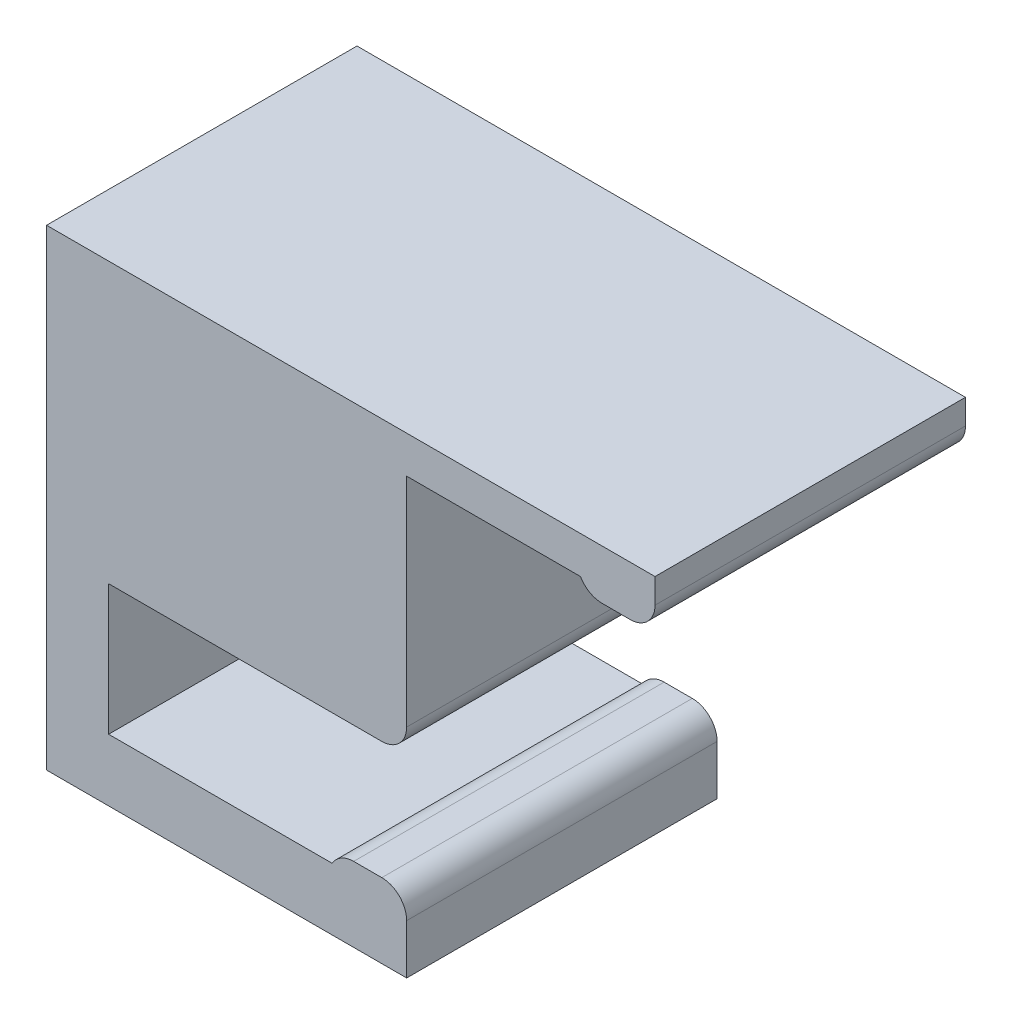
ISO-10303-21;
HEADER;
FILE_DESCRIPTION(('STEP AP214'),'2;1');
FILE_NAME('part.step','',(''),(''),'','','');
FILE_SCHEMA(('AUTOMOTIVE_DESIGN { 1 0 10303 214 1 1 1 1 }'));
ENDSEC;
DATA;
#1=APPLICATION_CONTEXT('core data for automotive mechanical design processes');
#2=APPLICATION_PROTOCOL_DEFINITION('international standard','automotive_design',2000,#1);
#3=PRODUCT_CONTEXT('',#1,'mechanical');
#4=PRODUCT('Part','Part','',(#3));
#5=PRODUCT_RELATED_PRODUCT_CATEGORY('part','',(#4));
#6=PRODUCT_DEFINITION_FORMATION('','',#4);
#7=PRODUCT_DEFINITION_CONTEXT('part definition',#1,'design');
#8=PRODUCT_DEFINITION('design','',#6,#7);
#9=PRODUCT_DEFINITION_SHAPE('','',#8);
#10=(LENGTH_UNIT() NAMED_UNIT(*) SI_UNIT(.MILLI.,.METRE.));
#11=(NAMED_UNIT(*) PLANE_ANGLE_UNIT() SI_UNIT($,.RADIAN.));
#12=(NAMED_UNIT(*) SI_UNIT($,.STERADIAN.) SOLID_ANGLE_UNIT());
#13=UNCERTAINTY_MEASURE_WITH_UNIT(LENGTH_MEASURE(1.E-05),#10,'distance_accuracy_value','');
#14=(GEOMETRIC_REPRESENTATION_CONTEXT(3) GLOBAL_UNCERTAINTY_ASSIGNED_CONTEXT((#13)) GLOBAL_UNIT_ASSIGNED_CONTEXT((#10,
#11,#12)) REPRESENTATION_CONTEXT('',''));
#15=CARTESIAN_POINT('',(0.,0.,0.));
#16=DIRECTION('',(0.,0.,1.));
#17=DIRECTION('',(1.,0.,0.));
#18=AXIS2_PLACEMENT_3D('',#15,#16,#17);
#19=CARTESIAN_POINT('',(14.5,0.,12.5));
#20=DIRECTION('',(1.,0.,0.));
#21=DIRECTION('',(0.,0.,-1.));
#22=AXIS2_PLACEMENT_3D('',#19,#20,#21);
#23=PLANE('',#22);
#24=DIRECTION('',(0.,-1.,0.));
#25=VECTOR('',#24,1.);
#26=CARTESIAN_POINT('',(14.5,0.,12.5));
#27=LINE('',#26,#25);
#28=CARTESIAN_POINT('',(14.5,17.5,12.5));
#29=VERTEX_POINT('',#28);
#30=CARTESIAN_POINT('',(14.5,8.75,12.5));
#31=VERTEX_POINT('',#30);
#32=EDGE_CURVE('E159',#29,#31,#27,.T.);
#33=ORIENTED_EDGE('',*,*,#32,.T.);
#34=DIRECTION('',(0.,0.,-1.));
#35=VECTOR('',#34,1.);
#36=CARTESIAN_POINT('',(14.5,8.75,0.));
#37=LINE('',#36,#35);
#38=CARTESIAN_POINT('',(14.5,8.75,0.));
#39=VERTEX_POINT('',#38);
#40=EDGE_CURVE('E42',#31,#39,#37,.T.);
#41=ORIENTED_EDGE('',*,*,#40,.T.);
#42=DIRECTION('',(0.,-1.,0.));
#43=VECTOR('',#42,1.);
#44=CARTESIAN_POINT('',(14.5,0.,0.));
#45=LINE('',#44,#43);
#46=CARTESIAN_POINT('',(14.5,17.5,0.));
#47=VERTEX_POINT('',#46);
#48=EDGE_CURVE('E162',#47,#39,#45,.T.);
#49=ORIENTED_EDGE('',*,*,#48,.F.);
#50=DIRECTION('',(0.,0.,-1.));
#51=VECTOR('',#50,1.);
#52=CARTESIAN_POINT('',(14.5,17.5,12.5));
#53=LINE('',#52,#51);
#54=EDGE_CURVE('E155',#29,#47,#53,.T.);
#55=ORIENTED_EDGE('',*,*,#54,.F.);
#56=EDGE_LOOP('',(#33,#41,#49,#55));
#57=FACE_BOUND('',#56,.T.);
#58=ADVANCED_FACE('F34',(#57),#23,.T.);
#59=CARTESIAN_POINT('',(0.,17.5,12.5));
#60=DIRECTION('',(0.,1.,0.));
#61=DIRECTION('',(0.,0.,1.));
#62=AXIS2_PLACEMENT_3D('',#59,#60,#61);
#63=PLANE('',#62);
#64=DIRECTION('',(1.,0.,0.));
#65=VECTOR('',#64,1.);
#66=CARTESIAN_POINT('',(0.,17.5,0.));
#67=LINE('',#66,#65);
#68=CARTESIAN_POINT('',(21.5,17.5,0.));
#69=VERTEX_POINT('',#68);
#70=EDGE_CURVE('E210',#47,#69,#67,.T.);
#71=ORIENTED_EDGE('',*,*,#70,.T.);
#72=DIRECTION('',(0.,0.,-1.));
#73=VECTOR('',#72,1.);
#74=CARTESIAN_POINT('',(21.5,17.5,12.5));
#75=LINE('',#74,#73);
#76=CARTESIAN_POINT('',(21.5,17.5,12.5));
#77=VERTEX_POINT('',#76);
#78=EDGE_CURVE('E167',#77,#69,#75,.T.);
#79=ORIENTED_EDGE('',*,*,#78,.F.);
#80=DIRECTION('',(1.,0.,0.));
#81=VECTOR('',#80,1.);
#82=CARTESIAN_POINT('',(0.,17.5,12.5));
#83=LINE('',#82,#81);
#84=EDGE_CURVE('E170',#29,#77,#83,.T.);
#85=ORIENTED_EDGE('',*,*,#84,.F.);
#86=ORIENTED_EDGE('',*,*,#54,.T.);
#87=EDGE_LOOP('',(#71,#79,#85,#86));
#88=FACE_BOUND('',#87,.T.);
#89=ADVANCED_FACE('F171',(#88),#63,.F.);
#90=CARTESIAN_POINT('',(0.,17.,12.5));
#91=DIRECTION('',(0.,-1.,0.));
#92=DIRECTION('',(0.,0.,-1.));
#93=AXIS2_PLACEMENT_3D('',#90,#91,#92);
#94=PLANE('',#93);
#95=DIRECTION('',(-1.,0.,0.));
#96=VECTOR('',#95,1.);
#97=CARTESIAN_POINT('',(0.,17.,0.));
#98=LINE('',#97,#96);
#99=CARTESIAN_POINT('',(23.5,17.,0.));
#100=VERTEX_POINT('',#99);
#101=CARTESIAN_POINT('',(22.3660254037844,17.,0.));
#102=VERTEX_POINT('',#101);
#103=EDGE_CURVE('E212',#100,#102,#98,.T.);
#104=ORIENTED_EDGE('',*,*,#103,.F.);
#105=DIRECTION('',(0.,0.,-1.));
#106=VECTOR('',#105,1.);
#107=CARTESIAN_POINT('',(23.5,17.,12.5));
#108=LINE('',#107,#106);
#109=CARTESIAN_POINT('',(23.5,17.,12.5));
#110=VERTEX_POINT('',#109);
#111=EDGE_CURVE('E267',#100,#110,#108,.F.);
#112=ORIENTED_EDGE('',*,*,#111,.T.);
#113=DIRECTION('',(-1.,0.,0.));
#114=VECTOR('',#113,1.);
#115=CARTESIAN_POINT('',(0.,17.,12.5));
#116=LINE('',#115,#114);
#117=CARTESIAN_POINT('',(22.3660254037844,17.,12.5));
#118=VERTEX_POINT('',#117);
#119=EDGE_CURVE('E175',#110,#118,#116,.T.);
#120=ORIENTED_EDGE('',*,*,#119,.T.);
#121=DIRECTION('',(0.,0.,1.));
#122=VECTOR('',#121,1.);
#123=CARTESIAN_POINT('',(22.3660254037844,17.,0.));
#124=LINE('',#123,#122);
#125=EDGE_CURVE('E264',#118,#102,#124,.F.);
#126=ORIENTED_EDGE('',*,*,#125,.T.);
#127=EDGE_LOOP('',(#104,#112,#120,#126));
#128=FACE_BOUND('',#127,.T.);
#129=ADVANCED_FACE('F294',(#128),#94,.T.);
#130=CARTESIAN_POINT('',(24.5,0.,12.5));
#131=DIRECTION('',(-1.,0.,0.));
#132=DIRECTION('',(0.,-1.,0.));
#133=AXIS2_PLACEMENT_3D('',#130,#131,#132);
#134=PLANE('',#133);
#135=DIRECTION('',(0.,1.,0.));
#136=VECTOR('',#135,1.);
#137=CARTESIAN_POINT('',(24.5,0.,12.5));
#138=LINE('',#137,#136);
#139=CARTESIAN_POINT('',(24.5,18.,12.5));
#140=VERTEX_POINT('',#139);
#141=CARTESIAN_POINT('',(24.5,19.,12.5));
#142=VERTEX_POINT('',#141);
#143=EDGE_CURVE('E188',#140,#142,#138,.T.);
#144=ORIENTED_EDGE('',*,*,#143,.F.);
#145=DIRECTION('',(0.,0.,-1.));
#146=VECTOR('',#145,1.);
#147=CARTESIAN_POINT('',(24.5,18.,0.));
#148=LINE('',#147,#146);
#149=CARTESIAN_POINT('',(24.5,18.,0.));
#150=VERTEX_POINT('',#149);
#151=EDGE_CURVE('E166',#140,#150,#148,.T.);
#152=ORIENTED_EDGE('',*,*,#151,.T.);
#153=DIRECTION('',(0.,1.,0.));
#154=VECTOR('',#153,1.);
#155=CARTESIAN_POINT('',(24.5,0.,0.));
#156=LINE('',#155,#154);
#157=CARTESIAN_POINT('',(24.5,19.,0.));
#158=VERTEX_POINT('',#157);
#159=EDGE_CURVE('E215',#150,#158,#156,.T.);
#160=ORIENTED_EDGE('',*,*,#159,.T.);
#161=DIRECTION('',(0.,0.,-1.));
#162=VECTOR('',#161,1.);
#163=CARTESIAN_POINT('',(24.5,19.,12.5));
#164=LINE('',#163,#162);
#165=EDGE_CURVE('E248',#142,#158,#164,.T.);
#166=ORIENTED_EDGE('',*,*,#165,.F.);
#167=EDGE_LOOP('',(#144,#152,#160,#166));
#168=FACE_BOUND('',#167,.T.);
#169=ADVANCED_FACE('F302',(#168),#134,.F.);
#170=CARTESIAN_POINT('',(0.,19.,12.5));
#171=DIRECTION('',(0.,-1.,0.));
#172=DIRECTION('',(1.,0.,0.));
#173=AXIS2_PLACEMENT_3D('',#170,#171,#172);
#174=PLANE('',#173);
#175=DIRECTION('',(-1.,0.,0.));
#176=VECTOR('',#175,1.);
#177=CARTESIAN_POINT('',(0.,19.,0.));
#178=LINE('',#177,#176);
#179=CARTESIAN_POINT('',(0.,19.,0.));
#180=VERTEX_POINT('',#179);
#181=EDGE_CURVE('E217',#158,#180,#178,.T.);
#182=ORIENTED_EDGE('',*,*,#181,.T.);
#183=DIRECTION('',(0.,0.,-1.));
#184=VECTOR('',#183,1.);
#185=CARTESIAN_POINT('',(0.,19.,12.5));
#186=LINE('',#185,#184);
#187=CARTESIAN_POINT('',(0.,19.,12.5));
#188=VERTEX_POINT('',#187);
#189=EDGE_CURVE('E245',#188,#180,#186,.T.);
#190=ORIENTED_EDGE('',*,*,#189,.F.);
#191=DIRECTION('',(-1.,0.,0.));
#192=VECTOR('',#191,1.);
#193=CARTESIAN_POINT('',(0.,19.,12.5));
#194=LINE('',#193,#192);
#195=EDGE_CURVE('E190',#142,#188,#194,.T.);
#196=ORIENTED_EDGE('',*,*,#195,.F.);
#197=ORIENTED_EDGE('',*,*,#165,.T.);
#198=EDGE_LOOP('',(#182,#190,#196,#197));
#199=FACE_BOUND('',#198,.T.);
#200=ADVANCED_FACE('F307',(#199),#174,.F.);
#201=CARTESIAN_POINT('',(0.,0.,12.5));
#202=DIRECTION('',(1.,0.,0.));
#203=DIRECTION('',(0.,0.,-1.));
#204=AXIS2_PLACEMENT_3D('',#201,#202,#203);
#205=PLANE('',#204);
#206=DIRECTION('',(0.,-1.,0.));
#207=VECTOR('',#206,1.);
#208=CARTESIAN_POINT('',(0.,0.,0.));
#209=LINE('',#208,#207);
#210=CARTESIAN_POINT('',(0.,0.,0.));
#211=VERTEX_POINT('',#210);
#212=EDGE_CURVE('E219',#180,#211,#209,.T.);
#213=ORIENTED_EDGE('',*,*,#212,.T.);
#214=DIRECTION('',(0.,0.,-1.));
#215=VECTOR('',#214,1.);
#216=CARTESIAN_POINT('',(0.,0.,12.5));
#217=LINE('',#216,#215);
#218=CARTESIAN_POINT('',(0.,0.,12.5));
#219=VERTEX_POINT('',#218);
#220=EDGE_CURVE('E242',#219,#211,#217,.T.);
#221=ORIENTED_EDGE('',*,*,#220,.F.);
#222=DIRECTION('',(0.,-1.,0.));
#223=VECTOR('',#222,1.);
#224=CARTESIAN_POINT('',(0.,0.,12.5));
#225=LINE('',#224,#223);
#226=EDGE_CURVE('E192',#188,#219,#225,.T.);
#227=ORIENTED_EDGE('',*,*,#226,.F.);
#228=ORIENTED_EDGE('',*,*,#189,.T.);
#229=EDGE_LOOP('',(#213,#221,#227,#228));
#230=FACE_BOUND('',#229,.T.);
#231=ADVANCED_FACE('F314',(#230),#205,.F.);
#232=CARTESIAN_POINT('',(0.,0.,12.5));
#233=DIRECTION('',(0.,1.,0.));
#234=DIRECTION('',(-1.,0.,0.));
#235=AXIS2_PLACEMENT_3D('',#232,#233,#234);
#236=PLANE('',#235);
#237=DIRECTION('',(1.,0.,0.));
#238=VECTOR('',#237,1.);
#239=CARTESIAN_POINT('',(0.,0.,0.));
#240=LINE('',#239,#238);
#241=CARTESIAN_POINT('',(14.5,0.,0.));
#242=VERTEX_POINT('',#241);
#243=EDGE_CURVE('E221',#211,#242,#240,.T.);
#244=ORIENTED_EDGE('',*,*,#243,.T.);
#245=DIRECTION('',(0.,0.,-1.));
#246=VECTOR('',#245,1.);
#247=CARTESIAN_POINT('',(14.5,0.,12.5));
#248=LINE('',#247,#246);
#249=CARTESIAN_POINT('',(14.5,0.,12.5));
#250=VERTEX_POINT('',#249);
#251=EDGE_CURVE('E239',#250,#242,#248,.T.);
#252=ORIENTED_EDGE('',*,*,#251,.F.);
#253=DIRECTION('',(1.,0.,0.));
#254=VECTOR('',#253,1.);
#255=CARTESIAN_POINT('',(0.,0.,12.5));
#256=LINE('',#255,#254);
#257=EDGE_CURVE('E194',#219,#250,#256,.T.);
#258=ORIENTED_EDGE('',*,*,#257,.F.);
#259=ORIENTED_EDGE('',*,*,#220,.T.);
#260=EDGE_LOOP('',(#244,#252,#258,#259));
#261=FACE_BOUND('',#260,.T.);
#262=ADVANCED_FACE('F318',(#261),#236,.F.);
#263=CARTESIAN_POINT('',(14.5,0.,12.5));
#264=DIRECTION('',(1.,0.,0.));
#265=DIRECTION('',(0.,0.,-1.));
#266=AXIS2_PLACEMENT_3D('',#263,#264,#265);
#267=PLANE('',#266);
#268=DIRECTION('',(0.,-1.,0.));
#269=VECTOR('',#268,1.);
#270=CARTESIAN_POINT('',(14.5,0.,0.));
#271=LINE('',#270,#269);
#272=CARTESIAN_POINT('',(14.5,2.,0.));
#273=VERTEX_POINT('',#272);
#274=EDGE_CURVE('E224',#273,#242,#271,.T.);
#275=ORIENTED_EDGE('',*,*,#274,.F.);
#276=DIRECTION('',(0.,0.,-1.));
#277=VECTOR('',#276,1.);
#278=CARTESIAN_POINT('',(14.5,2.,12.5));
#279=LINE('',#278,#277);
#280=CARTESIAN_POINT('',(14.5,2.,12.5));
#281=VERTEX_POINT('',#280);
#282=EDGE_CURVE('E282',#273,#281,#279,.F.);
#283=ORIENTED_EDGE('',*,*,#282,.T.);
#284=DIRECTION('',(0.,-1.,0.));
#285=VECTOR('',#284,1.);
#286=CARTESIAN_POINT('',(14.5,0.,12.5));
#287=LINE('',#286,#285);
#288=EDGE_CURVE('E197',#281,#250,#287,.T.);
#289=ORIENTED_EDGE('',*,*,#288,.T.);
#290=ORIENTED_EDGE('',*,*,#251,.T.);
#291=EDGE_LOOP('',(#275,#283,#289,#290));
#292=FACE_BOUND('',#291,.T.);
#293=ADVANCED_FACE('F321',(#292),#267,.T.);
#294=CARTESIAN_POINT('',(0.,3.,12.5));
#295=DIRECTION('',(0.,-1.,0.));
#296=DIRECTION('',(0.,0.,-1.));
#297=AXIS2_PLACEMENT_3D('',#294,#295,#296);
#298=PLANE('',#297);
#299=DIRECTION('',(-1.,0.,0.));
#300=VECTOR('',#299,1.);
#301=CARTESIAN_POINT('',(0.,3.,0.));
#302=LINE('',#301,#300);
#303=CARTESIAN_POINT('',(13.5,3.,0.));
#304=VERTEX_POINT('',#303);
#305=CARTESIAN_POINT('',(12.3660254037844,3.,0.));
#306=VERTEX_POINT('',#305);
#307=EDGE_CURVE('E226',#304,#306,#302,.T.);
#308=ORIENTED_EDGE('',*,*,#307,.T.);
#309=DIRECTION('',(0.,0.,1.));
#310=VECTOR('',#309,1.);
#311=CARTESIAN_POINT('',(12.3660254037844,3.,12.5));
#312=LINE('',#311,#310);
#313=CARTESIAN_POINT('',(12.3660254037844,3.,12.5));
#314=VERTEX_POINT('',#313);
#315=EDGE_CURVE('E55',#306,#314,#312,.T.);
#316=ORIENTED_EDGE('',*,*,#315,.T.);
#317=DIRECTION('',(-1.,0.,0.));
#318=VECTOR('',#317,1.);
#319=CARTESIAN_POINT('',(0.,3.,12.5));
#320=LINE('',#319,#318);
#321=CARTESIAN_POINT('',(13.5,3.,12.5));
#322=VERTEX_POINT('',#321);
#323=EDGE_CURVE('E199',#322,#314,#320,.T.);
#324=ORIENTED_EDGE('',*,*,#323,.F.);
#325=DIRECTION('',(0.,0.,-1.));
#326=VECTOR('',#325,1.);
#327=CARTESIAN_POINT('',(13.5,3.,0.));
#328=LINE('',#327,#326);
#329=EDGE_CURVE('E278',#322,#304,#328,.T.);
#330=ORIENTED_EDGE('',*,*,#329,.T.);
#331=EDGE_LOOP('',(#308,#316,#324,#330));
#332=FACE_BOUND('',#331,.T.);
#333=ADVANCED_FACE('F328',(#332),#298,.F.);
#334=CARTESIAN_POINT('',(0.,2.5,12.5));
#335=DIRECTION('',(0.,1.,0.));
#336=DIRECTION('',(0.,0.,1.));
#337=AXIS2_PLACEMENT_3D('',#334,#335,#336);
#338=PLANE('',#337);
#339=DIRECTION('',(1.,0.,0.));
#340=VECTOR('',#339,1.);
#341=CARTESIAN_POINT('',(0.,2.5,0.));
#342=LINE('',#341,#340);
#343=CARTESIAN_POINT('',(2.5,2.5,0.));
#344=VERTEX_POINT('',#343);
#345=CARTESIAN_POINT('',(11.5,2.5,0.));
#346=VERTEX_POINT('',#345);
#347=EDGE_CURVE('E228',#344,#346,#342,.T.);
#348=ORIENTED_EDGE('',*,*,#347,.F.);
#349=DIRECTION('',(0.,0.,-1.));
#350=VECTOR('',#349,1.);
#351=CARTESIAN_POINT('',(2.5,2.5,12.5));
#352=LINE('',#351,#350);
#353=CARTESIAN_POINT('',(2.5,2.5,12.5));
#354=VERTEX_POINT('',#353);
#355=EDGE_CURVE('E234',#354,#344,#352,.T.);
#356=ORIENTED_EDGE('',*,*,#355,.F.);
#357=DIRECTION('',(1.,0.,0.));
#358=VECTOR('',#357,1.);
#359=CARTESIAN_POINT('',(0.,2.5,12.5));
#360=LINE('',#359,#358);
#361=CARTESIAN_POINT('',(11.5,2.5,12.5));
#362=VERTEX_POINT('',#361);
#363=EDGE_CURVE('E201',#354,#362,#360,.T.);
#364=ORIENTED_EDGE('',*,*,#363,.T.);
#365=DIRECTION('',(0.,0.,-1.));
#366=VECTOR('',#365,1.);
#367=CARTESIAN_POINT('',(11.5,2.5,12.5));
#368=LINE('',#367,#366);
#369=EDGE_CURVE('E236',#362,#346,#368,.T.);
#370=ORIENTED_EDGE('',*,*,#369,.T.);
#371=EDGE_LOOP('',(#348,#356,#364,#370));
#372=FACE_BOUND('',#371,.T.);
#373=ADVANCED_FACE('F336',(#372),#338,.T.);
#374=CARTESIAN_POINT('',(2.5,0.,12.5));
#375=DIRECTION('',(-1.,0.,0.));
#376=DIRECTION('',(0.,0.,1.));
#377=AXIS2_PLACEMENT_3D('',#374,#375,#376);
#378=PLANE('',#377);
#379=DIRECTION('',(0.,1.,0.));
#380=VECTOR('',#379,1.);
#381=CARTESIAN_POINT('',(2.5,0.,0.));
#382=LINE('',#381,#380);
#383=CARTESIAN_POINT('',(2.5,7.75,0.));
#384=VERTEX_POINT('',#383);
#385=EDGE_CURVE('E183',#344,#384,#382,.T.);
#386=ORIENTED_EDGE('',*,*,#385,.T.);
#387=DIRECTION('',(0.,0.,-1.));
#388=VECTOR('',#387,1.);
#389=CARTESIAN_POINT('',(2.5,7.75,12.5));
#390=LINE('',#389,#388);
#391=CARTESIAN_POINT('',(2.5,7.75,12.5));
#392=VERTEX_POINT('',#391);
#393=EDGE_CURVE('E208',#392,#384,#390,.T.);
#394=ORIENTED_EDGE('',*,*,#393,.F.);
#395=DIRECTION('',(0.,1.,0.));
#396=VECTOR('',#395,1.);
#397=CARTESIAN_POINT('',(2.5,0.,12.5));
#398=LINE('',#397,#396);
#399=EDGE_CURVE('E204',#354,#392,#398,.T.);
#400=ORIENTED_EDGE('',*,*,#399,.F.);
#401=ORIENTED_EDGE('',*,*,#355,.T.);
#402=EDGE_LOOP('',(#386,#394,#400,#401));
#403=FACE_BOUND('',#402,.T.);
#404=ADVANCED_FACE('F341',(#403),#378,.F.);
#405=CARTESIAN_POINT('',(0.,7.75,12.5));
#406=DIRECTION('',(0.,1.,0.));
#407=DIRECTION('',(-1.,0.,0.));
#408=AXIS2_PLACEMENT_3D('',#405,#406,#407);
#409=PLANE('',#408);
#410=DIRECTION('',(1.,0.,0.));
#411=VECTOR('',#410,1.);
#412=CARTESIAN_POINT('',(0.,7.75,0.));
#413=LINE('',#412,#411);
#414=CARTESIAN_POINT('',(13.5,7.75,0.));
#415=VERTEX_POINT('',#414);
#416=EDGE_CURVE('E181',#384,#415,#413,.T.);
#417=ORIENTED_EDGE('',*,*,#416,.T.);
#418=DIRECTION('',(0.,0.,-1.));
#419=VECTOR('',#418,1.);
#420=CARTESIAN_POINT('',(13.5,7.75,12.5));
#421=LINE('',#420,#419);
#422=CARTESIAN_POINT('',(13.5,7.75,12.5));
#423=VERTEX_POINT('',#422);
#424=EDGE_CURVE('E11',#415,#423,#421,.F.);
#425=ORIENTED_EDGE('',*,*,#424,.T.);
#426=DIRECTION('',(1.,0.,0.));
#427=VECTOR('',#426,1.);
#428=CARTESIAN_POINT('',(0.,7.75,12.5));
#429=LINE('',#428,#427);
#430=EDGE_CURVE('E206',#392,#423,#429,.T.);
#431=ORIENTED_EDGE('',*,*,#430,.F.);
#432=ORIENTED_EDGE('',*,*,#393,.T.);
#433=EDGE_LOOP('',(#417,#425,#431,#432));
#434=FACE_BOUND('',#433,.T.);
#435=ADVANCED_FACE('F342',(#434),#409,.F.);
#436=CARTESIAN_POINT('',(0.,0.,12.5));
#437=DIRECTION('',(0.,0.,1.));
#438=DIRECTION('',(1.,0.,0.));
#439=AXIS2_PLACEMENT_3D('',#436,#437,#438);
#440=PLANE('',#439);
#441=ORIENTED_EDGE('',*,*,#119,.F.);
#442=CARTESIAN_POINT('',(23.5,18.,12.5));
#443=DIRECTION('',(0.,0.,1.));
#444=DIRECTION('',(1.,0.,0.));
#445=AXIS2_PLACEMENT_3D('',#442,#443,#444);
#446=CIRCLE('',#445,1.);
#447=EDGE_CURVE('E276',#110,#140,#446,.T.);
#448=ORIENTED_EDGE('',*,*,#447,.T.);
#449=ORIENTED_EDGE('',*,*,#143,.T.);
#450=ORIENTED_EDGE('',*,*,#195,.T.);
#451=ORIENTED_EDGE('',*,*,#226,.T.);
#452=ORIENTED_EDGE('',*,*,#257,.T.);
#453=ORIENTED_EDGE('',*,*,#288,.F.);
#454=CARTESIAN_POINT('',(13.5,2.,12.5));
#455=DIRECTION('',(0.,0.,1.));
#456=DIRECTION('',(1.,0.,0.));
#457=AXIS2_PLACEMENT_3D('',#454,#455,#456);
#458=CIRCLE('',#457,1.);
#459=EDGE_CURVE('E270',#281,#322,#458,.T.);
#460=ORIENTED_EDGE('',*,*,#459,.T.);
#461=ORIENTED_EDGE('',*,*,#323,.T.);
#462=CARTESIAN_POINT('',(12.3660254037844,2.,12.5));
#463=DIRECTION('',(0.,0.,1.));
#464=DIRECTION('',(1.,0.,0.));
#465=AXIS2_PLACEMENT_3D('',#462,#463,#464);
#466=CIRCLE('',#465,1.);
#467=EDGE_CURVE('E272',#314,#362,#466,.T.);
#468=ORIENTED_EDGE('',*,*,#467,.T.);
#469=ORIENTED_EDGE('',*,*,#363,.F.);
#470=ORIENTED_EDGE('',*,*,#399,.T.);
#471=ORIENTED_EDGE('',*,*,#430,.T.);
#472=CARTESIAN_POINT('',(13.5,8.75,12.5));
#473=DIRECTION('',(0.,0.,1.));
#474=DIRECTION('',(1.,0.,0.));
#475=AXIS2_PLACEMENT_3D('',#472,#473,#474);
#476=CIRCLE('',#475,1.);
#477=EDGE_CURVE('E180',#423,#31,#476,.T.);
#478=ORIENTED_EDGE('',*,*,#477,.T.);
#479=ORIENTED_EDGE('',*,*,#32,.F.);
#480=ORIENTED_EDGE('',*,*,#84,.T.);
#481=CARTESIAN_POINT('',(22.3660254037844,18.,12.5));
#482=DIRECTION('',(0.,0.,1.));
#483=DIRECTION('',(1.,0.,0.));
#484=AXIS2_PLACEMENT_3D('',#481,#482,#483);
#485=CIRCLE('',#484,1.);
#486=EDGE_CURVE('E274',#77,#118,#485,.T.);
#487=ORIENTED_EDGE('',*,*,#486,.T.);
#488=EDGE_LOOP('',(#441,#448,#449,#450,#451,#452,#453,#460,#461,#468,#469,#470,#471,#478,#479,
#480,#487));
#489=FACE_BOUND('',#488,.T.);
#490=ADVANCED_FACE('F178',(#489),#440,.T.);
#491=CARTESIAN_POINT('',(0.,0.,0.));
#492=DIRECTION('',(0.,0.,1.));
#493=DIRECTION('',(1.,0.,0.));
#494=AXIS2_PLACEMENT_3D('',#491,#492,#493);
#495=PLANE('',#494);
#496=ORIENTED_EDGE('',*,*,#159,.F.);
#497=CARTESIAN_POINT('',(23.5,18.,0.));
#498=DIRECTION('',(0.,0.,1.));
#499=DIRECTION('',(1.,0.,0.));
#500=AXIS2_PLACEMENT_3D('',#497,#498,#499);
#501=CIRCLE('',#500,1.);
#502=EDGE_CURVE('E262',#150,#100,#501,.F.);
#503=ORIENTED_EDGE('',*,*,#502,.T.);
#504=ORIENTED_EDGE('',*,*,#103,.T.);
#505=CARTESIAN_POINT('',(22.3660254037844,18.,0.));
#506=DIRECTION('',(0.,0.,1.));
#507=DIRECTION('',(1.,0.,0.));
#508=AXIS2_PLACEMENT_3D('',#505,#506,#507);
#509=CIRCLE('',#508,1.);
#510=EDGE_CURVE('E260',#102,#69,#509,.F.);
#511=ORIENTED_EDGE('',*,*,#510,.T.);
#512=ORIENTED_EDGE('',*,*,#70,.F.);
#513=ORIENTED_EDGE('',*,*,#48,.T.);
#514=CARTESIAN_POINT('',(13.5,8.75,0.));
#515=DIRECTION('',(0.,0.,1.));
#516=DIRECTION('',(1.,0.,0.));
#517=AXIS2_PLACEMENT_3D('',#514,#515,#516);
#518=CIRCLE('',#517,1.);
#519=EDGE_CURVE('E254',#39,#415,#518,.F.);
#520=ORIENTED_EDGE('',*,*,#519,.T.);
#521=ORIENTED_EDGE('',*,*,#416,.F.);
#522=ORIENTED_EDGE('',*,*,#385,.F.);
#523=ORIENTED_EDGE('',*,*,#347,.T.);
#524=CARTESIAN_POINT('',(12.3660254037844,2.,0.));
#525=DIRECTION('',(0.,0.,1.));
#526=DIRECTION('',(1.,0.,0.));
#527=AXIS2_PLACEMENT_3D('',#524,#525,#526);
#528=CIRCLE('',#527,1.);
#529=EDGE_CURVE('E258',#346,#306,#528,.F.);
#530=ORIENTED_EDGE('',*,*,#529,.T.);
#531=ORIENTED_EDGE('',*,*,#307,.F.);
#532=CARTESIAN_POINT('',(13.5,2.,0.));
#533=DIRECTION('',(0.,0.,1.));
#534=DIRECTION('',(1.,0.,0.));
#535=AXIS2_PLACEMENT_3D('',#532,#533,#534);
#536=CIRCLE('',#535,1.);
#537=EDGE_CURVE('E256',#304,#273,#536,.F.);
#538=ORIENTED_EDGE('',*,*,#537,.T.);
#539=ORIENTED_EDGE('',*,*,#274,.T.);
#540=ORIENTED_EDGE('',*,*,#243,.F.);
#541=ORIENTED_EDGE('',*,*,#212,.F.);
#542=ORIENTED_EDGE('',*,*,#181,.F.);
#543=EDGE_LOOP('',(#496,#503,#504,#511,#512,#513,#520,#521,#522,#523,#530,#531,#538,#539,#540,
#541,#542));
#544=FACE_BOUND('',#543,.T.);
#545=ADVANCED_FACE('F286',(#544),#495,.F.);
#546=CARTESIAN_POINT('',(23.5,18.,12.5));
#547=DIRECTION('',(0.,0.,1.));
#548=DIRECTION('',(1.,0.,0.));
#549=AXIS2_PLACEMENT_3D('',#546,#547,#548);
#550=CYLINDRICAL_SURFACE('',#549,1.);
#551=ORIENTED_EDGE('',*,*,#447,.F.);
#552=ORIENTED_EDGE('',*,*,#111,.F.);
#553=ORIENTED_EDGE('',*,*,#502,.F.);
#554=ORIENTED_EDGE('',*,*,#151,.F.);
#555=EDGE_LOOP('',(#551,#552,#553,#554));
#556=FACE_BOUND('',#555,.T.);
#557=ADVANCED_FACE('F297',(#556),#550,.T.);
#558=CARTESIAN_POINT('',(22.3660254037844,18.,12.5));
#559=DIRECTION('',(0.,0.,-1.));
#560=DIRECTION('',(-1.,0.,0.));
#561=AXIS2_PLACEMENT_3D('',#558,#559,#560);
#562=CYLINDRICAL_SURFACE('',#561,1.);
#563=ORIENTED_EDGE('',*,*,#486,.F.);
#564=ORIENTED_EDGE('',*,*,#78,.T.);
#565=ORIENTED_EDGE('',*,*,#510,.F.);
#566=ORIENTED_EDGE('',*,*,#125,.F.);
#567=EDGE_LOOP('',(#563,#564,#565,#566));
#568=FACE_BOUND('',#567,.T.);
#569=ADVANCED_FACE('F289',(#568),#562,.T.);
#570=CARTESIAN_POINT('',(12.3660254037844,2.,12.5));
#571=DIRECTION('',(0.,0.,1.));
#572=DIRECTION('',(1.,0.,0.));
#573=AXIS2_PLACEMENT_3D('',#570,#571,#572);
#574=CYLINDRICAL_SURFACE('',#573,1.);
#575=ORIENTED_EDGE('',*,*,#467,.F.);
#576=ORIENTED_EDGE('',*,*,#315,.F.);
#577=ORIENTED_EDGE('',*,*,#529,.F.);
#578=ORIENTED_EDGE('',*,*,#369,.F.);
#579=EDGE_LOOP('',(#575,#576,#577,#578));
#580=FACE_BOUND('',#579,.T.);
#581=ADVANCED_FACE('F334',(#580),#574,.T.);
#582=CARTESIAN_POINT('',(13.5,2.,12.5));
#583=DIRECTION('',(0.,0.,1.));
#584=DIRECTION('',(1.,0.,0.));
#585=AXIS2_PLACEMENT_3D('',#582,#583,#584);
#586=CYLINDRICAL_SURFACE('',#585,1.);
#587=ORIENTED_EDGE('',*,*,#459,.F.);
#588=ORIENTED_EDGE('',*,*,#282,.F.);
#589=ORIENTED_EDGE('',*,*,#537,.F.);
#590=ORIENTED_EDGE('',*,*,#329,.F.);
#591=EDGE_LOOP('',(#587,#588,#589,#590));
#592=FACE_BOUND('',#591,.T.);
#593=ADVANCED_FACE('F326',(#592),#586,.T.);
#594=CARTESIAN_POINT('',(13.5,8.75,12.5));
#595=DIRECTION('',(0.,0.,1.));
#596=DIRECTION('',(1.,0.,0.));
#597=AXIS2_PLACEMENT_3D('',#594,#595,#596);
#598=CYLINDRICAL_SURFACE('',#597,1.);
#599=ORIENTED_EDGE('',*,*,#477,.F.);
#600=ORIENTED_EDGE('',*,*,#424,.F.);
#601=ORIENTED_EDGE('',*,*,#519,.F.);
#602=ORIENTED_EDGE('',*,*,#40,.F.);
#603=EDGE_LOOP('',(#599,#600,#601,#602));
#604=FACE_BOUND('',#603,.T.);
#605=ADVANCED_FACE('F36',(#604),#598,.T.);
#606=CLOSED_SHELL('',(#58,#89,#129,#169,#200,#231,#262,#293,#333,#373,#404,#435,#490,#545,#557,
#569,#581,#593,#605));
#607=MANIFOLD_SOLID_BREP('B2',#606);
#608=ADVANCED_BREP_SHAPE_REPRESENTATION('',(#18,#607),#14);
#609=SHAPE_DEFINITION_REPRESENTATION(#9,#608);
ENDSEC;
END-ISO-10303-21;
